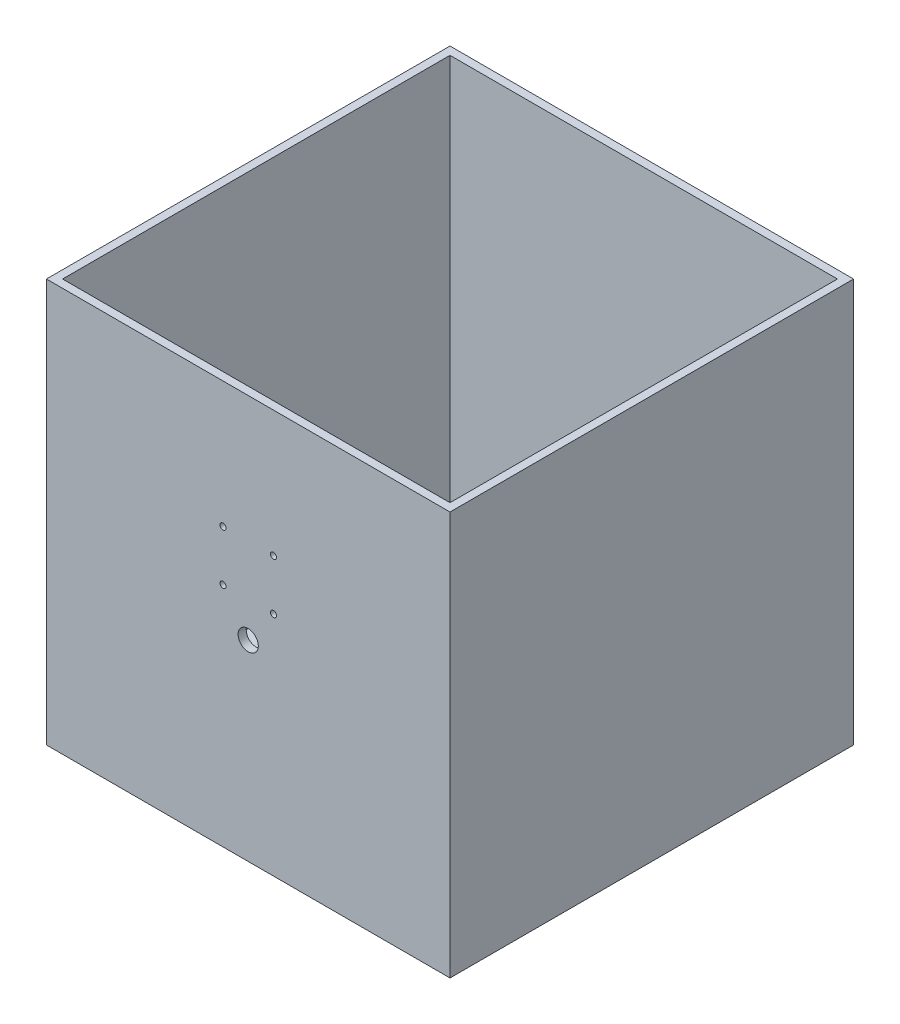
ISO-10303-21;
HEADER;
FILE_DESCRIPTION(('STEP AP214'),'2;1');
FILE_NAME('part.step','',(''),(''),'','','');
FILE_SCHEMA(('AUTOMOTIVE_DESIGN { 1 0 10303 214 1 1 1 1 }'));
ENDSEC;
DATA;
#1=APPLICATION_CONTEXT('core data for automotive mechanical design processes');
#2=APPLICATION_PROTOCOL_DEFINITION('international standard','automotive_design',2000,#1);
#3=PRODUCT_CONTEXT('',#1,'mechanical');
#4=PRODUCT('Part','Part','',(#3));
#5=PRODUCT_RELATED_PRODUCT_CATEGORY('part','',(#4));
#6=PRODUCT_DEFINITION_FORMATION('','',#4);
#7=PRODUCT_DEFINITION_CONTEXT('part definition',#1,'design');
#8=PRODUCT_DEFINITION('design','',#6,#7);
#9=PRODUCT_DEFINITION_SHAPE('','',#8);
#10=(LENGTH_UNIT() NAMED_UNIT(*) SI_UNIT(.MILLI.,.METRE.));
#11=(NAMED_UNIT(*) PLANE_ANGLE_UNIT() SI_UNIT($,.RADIAN.));
#12=(NAMED_UNIT(*) SI_UNIT($,.STERADIAN.) SOLID_ANGLE_UNIT());
#13=UNCERTAINTY_MEASURE_WITH_UNIT(LENGTH_MEASURE(1.E-05),#10,'distance_accuracy_value','');
#14=(GEOMETRIC_REPRESENTATION_CONTEXT(3) GLOBAL_UNCERTAINTY_ASSIGNED_CONTEXT((#13)) GLOBAL_UNIT_ASSIGNED_CONTEXT((#10,
#11,#12)) REPRESENTATION_CONTEXT('',''));
#15=CARTESIAN_POINT('',(0.,0.,0.));
#16=DIRECTION('',(0.,0.,1.));
#17=DIRECTION('',(1.,0.,0.));
#18=AXIS2_PLACEMENT_3D('',#15,#16,#17);
#19=CARTESIAN_POINT('',(0.,200.,0.));
#20=DIRECTION('',(0.,-1.,0.));
#21=DIRECTION('',(0.,0.,-1.));
#22=AXIS2_PLACEMENT_3D('',#19,#20,#21);
#23=PLANE('',#22);
#24=DIRECTION('',(0.,0.,-1.));
#25=VECTOR('',#24,1.);
#26=CARTESIAN_POINT('',(100.,200.,100.));
#27=LINE('',#26,#25);
#28=CARTESIAN_POINT('',(100.,200.,100.));
#29=VERTEX_POINT('',#28);
#30=CARTESIAN_POINT('',(100.,200.,-100.));
#31=VERTEX_POINT('',#30);
#32=EDGE_CURVE('E141',#29,#31,#27,.T.);
#33=ORIENTED_EDGE('',*,*,#32,.T.);
#34=DIRECTION('',(-1.,0.,0.));
#35=VECTOR('',#34,1.);
#36=CARTESIAN_POINT('',(-100.,200.,-100.));
#37=LINE('',#36,#35);
#38=CARTESIAN_POINT('',(-100.,200.,-100.));
#39=VERTEX_POINT('',#38);
#40=EDGE_CURVE('E85',#31,#39,#37,.T.);
#41=ORIENTED_EDGE('',*,*,#40,.T.);
#42=DIRECTION('',(0.,0.,1.));
#43=VECTOR('',#42,1.);
#44=CARTESIAN_POINT('',(-100.,200.,100.));
#45=LINE('',#44,#43);
#46=CARTESIAN_POINT('',(-100.,200.,100.));
#47=VERTEX_POINT('',#46);
#48=EDGE_CURVE('E144',#39,#47,#45,.T.);
#49=ORIENTED_EDGE('',*,*,#48,.T.);
#50=DIRECTION('',(1.,0.,0.));
#51=VECTOR('',#50,1.);
#52=CARTESIAN_POINT('',(-100.,200.,100.));
#53=LINE('',#52,#51);
#54=EDGE_CURVE('E57',#47,#29,#53,.T.);
#55=ORIENTED_EDGE('',*,*,#54,.T.);
#56=EDGE_LOOP('',(#33,#41,#49,#55));
#57=FACE_BOUND('',#56,.T.);
#58=DIRECTION('',(0.,0.,-1.));
#59=VECTOR('',#58,1.);
#60=CARTESIAN_POINT('',(96.,200.,0.));
#61=LINE('',#60,#59);
#62=CARTESIAN_POINT('',(96.,200.,96.));
#63=VERTEX_POINT('',#62);
#64=CARTESIAN_POINT('',(96.,200.,-96.));
#65=VERTEX_POINT('',#64);
#66=EDGE_CURVE('E130',#63,#65,#61,.T.);
#67=ORIENTED_EDGE('',*,*,#66,.F.);
#68=DIRECTION('',(1.,0.,0.));
#69=VECTOR('',#68,1.);
#70=CARTESIAN_POINT('',(0.,200.,96.));
#71=LINE('',#70,#69);
#72=CARTESIAN_POINT('',(-96.,200.,96.));
#73=VERTEX_POINT('',#72);
#74=EDGE_CURVE('E139',#73,#63,#71,.T.);
#75=ORIENTED_EDGE('',*,*,#74,.F.);
#76=DIRECTION('',(0.,0.,1.));
#77=VECTOR('',#76,1.);
#78=CARTESIAN_POINT('',(-96.,200.,0.));
#79=LINE('',#78,#77);
#80=CARTESIAN_POINT('',(-96.,200.,-96.));
#81=VERTEX_POINT('',#80);
#82=EDGE_CURVE('E137',#81,#73,#79,.T.);
#83=ORIENTED_EDGE('',*,*,#82,.F.);
#84=DIRECTION('',(-1.,0.,0.));
#85=VECTOR('',#84,1.);
#86=CARTESIAN_POINT('',(0.,200.,-96.));
#87=LINE('',#86,#85);
#88=EDGE_CURVE('E122',#65,#81,#87,.T.);
#89=ORIENTED_EDGE('',*,*,#88,.F.);
#90=EDGE_LOOP('',(#67,#75,#83,#89));
#91=FACE_BOUND('',#90,.T.);
#92=ADVANCED_FACE('F33',(#57,#91),#23,.F.);
#93=CARTESIAN_POINT('',(100.,200.,100.));
#94=DIRECTION('',(-1.,0.,0.));
#95=DIRECTION('',(0.,0.,1.));
#96=AXIS2_PLACEMENT_3D('',#93,#94,#95);
#97=PLANE('',#96);
#98=DIRECTION('',(0.,0.,-1.));
#99=VECTOR('',#98,1.);
#100=CARTESIAN_POINT('',(100.,0.,100.));
#101=LINE('',#100,#99);
#102=CARTESIAN_POINT('',(100.,0.,100.));
#103=VERTEX_POINT('',#102);
#104=CARTESIAN_POINT('',(100.,0.,-100.));
#105=VERTEX_POINT('',#104);
#106=EDGE_CURVE('E148',#103,#105,#101,.T.);
#107=ORIENTED_EDGE('',*,*,#106,.T.);
#108=DIRECTION('',(0.,-1.,0.));
#109=VECTOR('',#108,1.);
#110=CARTESIAN_POINT('',(100.,200.,-100.));
#111=LINE('',#110,#109);
#112=EDGE_CURVE('E11',#31,#105,#111,.T.);
#113=ORIENTED_EDGE('',*,*,#112,.F.);
#114=ORIENTED_EDGE('',*,*,#32,.F.);
#115=DIRECTION('',(0.,-1.,0.));
#116=VECTOR('',#115,1.);
#117=CARTESIAN_POINT('',(100.,200.,100.));
#118=LINE('',#117,#116);
#119=EDGE_CURVE('E147',#29,#103,#118,.T.);
#120=ORIENTED_EDGE('',*,*,#119,.T.);
#121=EDGE_LOOP('',(#107,#113,#114,#120));
#122=FACE_BOUND('',#121,.T.);
#123=ADVANCED_FACE('F35',(#122),#97,.F.);
#124=CARTESIAN_POINT('',(-100.,200.,-100.));
#125=DIRECTION('',(0.,0.,1.));
#126=DIRECTION('',(1.,0.,0.));
#127=AXIS2_PLACEMENT_3D('',#124,#125,#126);
#128=PLANE('',#127);
#129=DIRECTION('',(-1.,0.,0.));
#130=VECTOR('',#129,1.);
#131=CARTESIAN_POINT('',(-100.,0.,-100.));
#132=LINE('',#131,#130);
#133=CARTESIAN_POINT('',(-100.,0.,-100.));
#134=VERTEX_POINT('',#133);
#135=EDGE_CURVE('E151',#105,#134,#132,.T.);
#136=ORIENTED_EDGE('',*,*,#135,.T.);
#137=DIRECTION('',(0.,-1.,0.));
#138=VECTOR('',#137,1.);
#139=CARTESIAN_POINT('',(-100.,200.,-100.));
#140=LINE('',#139,#138);
#141=EDGE_CURVE('E41',#39,#134,#140,.T.);
#142=ORIENTED_EDGE('',*,*,#141,.F.);
#143=ORIENTED_EDGE('',*,*,#40,.F.);
#144=ORIENTED_EDGE('',*,*,#112,.T.);
#145=EDGE_LOOP('',(#136,#142,#143,#144));
#146=FACE_BOUND('',#145,.T.);
#147=ADVANCED_FACE('F182',(#146),#128,.F.);
#148=CARTESIAN_POINT('',(-100.,200.,100.));
#149=DIRECTION('',(1.,0.,0.));
#150=DIRECTION('',(0.,0.,-1.));
#151=AXIS2_PLACEMENT_3D('',#148,#149,#150);
#152=PLANE('',#151);
#153=CARTESIAN_POINT('',(-100.,15.,-70.));
#154=DIRECTION('',(-1.,0.,0.));
#155=DIRECTION('',(0.,0.,1.));
#156=AXIS2_PLACEMENT_3D('',#153,#154,#155);
#157=CIRCLE('',#156,3.00000000000001);
#158=CARTESIAN_POINT('',(-100.,15.,-67.));
#159=VERTEX_POINT('',#158);
#160=EDGE_CURVE('E238',#159,#159,#157,.T.);
#161=ORIENTED_EDGE('',*,*,#160,.F.);
#162=EDGE_LOOP('',(#161));
#163=FACE_BOUND('',#162,.T.);
#164=DIRECTION('',(0.,0.,1.));
#165=VECTOR('',#164,1.);
#166=CARTESIAN_POINT('',(-100.,0.,100.));
#167=LINE('',#166,#165);
#168=CARTESIAN_POINT('',(-100.,0.,100.));
#169=VERTEX_POINT('',#168);
#170=EDGE_CURVE('E153',#134,#169,#167,.T.);
#171=ORIENTED_EDGE('',*,*,#170,.T.);
#172=DIRECTION('',(0.,-1.,0.));
#173=VECTOR('',#172,1.);
#174=CARTESIAN_POINT('',(-100.,200.,100.));
#175=LINE('',#174,#173);
#176=EDGE_CURVE('E157',#47,#169,#175,.T.);
#177=ORIENTED_EDGE('',*,*,#176,.F.);
#178=ORIENTED_EDGE('',*,*,#48,.F.);
#179=ORIENTED_EDGE('',*,*,#141,.T.);
#180=EDGE_LOOP('',(#171,#177,#178,#179));
#181=FACE_BOUND('',#180,.T.);
#182=ADVANCED_FACE('F162',(#163,#181),#152,.F.);
#183=CARTESIAN_POINT('',(-100.,200.,100.));
#184=DIRECTION('',(0.,0.,-1.));
#185=DIRECTION('',(-1.,0.,0.));
#186=AXIS2_PLACEMENT_3D('',#183,#184,#185);
#187=PLANE('',#186);
#188=CARTESIAN_POINT('',(0.,95.,100.));
#189=DIRECTION('',(0.,0.,1.));
#190=DIRECTION('',(1.,0.,0.));
#191=AXIS2_PLACEMENT_3D('',#188,#189,#190);
#192=CIRCLE('',#191,5.);
#193=CARTESIAN_POINT('',(5.,95.,100.));
#194=VERTEX_POINT('',#193);
#195=EDGE_CURVE('E242',#194,#194,#192,.T.);
#196=ORIENTED_EDGE('',*,*,#195,.F.);
#197=EDGE_LOOP('',(#196));
#198=FACE_BOUND('',#197,.T.);
#199=CARTESIAN_POINT('',(-12.5,112.5,100.));
#200=DIRECTION('',(0.,0.,1.));
#201=DIRECTION('',(1.,0.,0.));
#202=AXIS2_PLACEMENT_3D('',#199,#200,#201);
#203=CIRCLE('',#202,1.5);
#204=CARTESIAN_POINT('',(-11.,112.5,100.));
#205=VERTEX_POINT('',#204);
#206=EDGE_CURVE('E249',#205,#205,#203,.T.);
#207=ORIENTED_EDGE('',*,*,#206,.F.);
#208=EDGE_LOOP('',(#207));
#209=FACE_BOUND('',#208,.T.);
#210=CARTESIAN_POINT('',(12.5,112.5,100.));
#211=DIRECTION('',(0.,0.,1.));
#212=DIRECTION('',(1.,0.,0.));
#213=AXIS2_PLACEMENT_3D('',#210,#211,#212);
#214=CIRCLE('',#213,1.5);
#215=CARTESIAN_POINT('',(14.,112.5,100.));
#216=VERTEX_POINT('',#215);
#217=EDGE_CURVE('E255',#216,#216,#214,.T.);
#218=ORIENTED_EDGE('',*,*,#217,.F.);
#219=EDGE_LOOP('',(#218));
#220=FACE_BOUND('',#219,.T.);
#221=CARTESIAN_POINT('',(12.5,137.5,100.));
#222=DIRECTION('',(0.,0.,1.));
#223=DIRECTION('',(1.,0.,0.));
#224=AXIS2_PLACEMENT_3D('',#221,#222,#223);
#225=CIRCLE('',#224,1.5);
#226=CARTESIAN_POINT('',(14.,137.5,100.));
#227=VERTEX_POINT('',#226);
#228=EDGE_CURVE('E261',#227,#227,#225,.T.);
#229=ORIENTED_EDGE('',*,*,#228,.F.);
#230=EDGE_LOOP('',(#229));
#231=FACE_BOUND('',#230,.T.);
#232=CARTESIAN_POINT('',(-12.5,137.5,100.));
#233=DIRECTION('',(0.,0.,1.));
#234=DIRECTION('',(1.,0.,0.));
#235=AXIS2_PLACEMENT_3D('',#232,#233,#234);
#236=CIRCLE('',#235,1.5);
#237=CARTESIAN_POINT('',(-11.,137.5,100.));
#238=VERTEX_POINT('',#237);
#239=EDGE_CURVE('E267',#238,#238,#236,.T.);
#240=ORIENTED_EDGE('',*,*,#239,.F.);
#241=EDGE_LOOP('',(#240));
#242=FACE_BOUND('',#241,.T.);
#243=DIRECTION('',(1.,0.,0.));
#244=VECTOR('',#243,1.);
#245=CARTESIAN_POINT('',(-100.,0.,100.));
#246=LINE('',#245,#244);
#247=EDGE_CURVE('E78',#169,#103,#246,.T.);
#248=ORIENTED_EDGE('',*,*,#247,.T.);
#249=ORIENTED_EDGE('',*,*,#119,.F.);
#250=ORIENTED_EDGE('',*,*,#54,.F.);
#251=ORIENTED_EDGE('',*,*,#176,.T.);
#252=EDGE_LOOP('',(#248,#249,#250,#251));
#253=FACE_BOUND('',#252,.T.);
#254=ADVANCED_FACE('F170',(#198,#209,#220,#231,#242,#253),#187,.F.);
#255=CARTESIAN_POINT('',(0.,0.,0.));
#256=DIRECTION('',(0.,-1.,0.));
#257=DIRECTION('',(0.,0.,-1.));
#258=AXIS2_PLACEMENT_3D('',#255,#256,#257);
#259=PLANE('',#258);
#260=ORIENTED_EDGE('',*,*,#106,.F.);
#261=ORIENTED_EDGE('',*,*,#247,.F.);
#262=ORIENTED_EDGE('',*,*,#170,.F.);
#263=ORIENTED_EDGE('',*,*,#135,.F.);
#264=EDGE_LOOP('',(#260,#261,#262,#263));
#265=FACE_BOUND('',#264,.T.);
#266=ADVANCED_FACE('F166',(#265),#259,.T.);
#267=CARTESIAN_POINT('',(96.,200.,100.));
#268=DIRECTION('',(-1.,0.,0.));
#269=DIRECTION('',(0.,0.,1.));
#270=AXIS2_PLACEMENT_3D('',#267,#268,#269);
#271=PLANE('',#270);
#272=DIRECTION('',(0.,0.,-1.));
#273=VECTOR('',#272,1.);
#274=CARTESIAN_POINT('',(96.,4.,0.));
#275=LINE('',#274,#273);
#276=CARTESIAN_POINT('',(96.,4.,96.));
#277=VERTEX_POINT('',#276);
#278=CARTESIAN_POINT('',(96.,4.,-96.));
#279=VERTEX_POINT('',#278);
#280=EDGE_CURVE('E113',#277,#279,#275,.T.);
#281=ORIENTED_EDGE('',*,*,#280,.F.);
#282=DIRECTION('',(0.,-1.,0.));
#283=VECTOR('',#282,1.);
#284=CARTESIAN_POINT('',(96.,200.,96.));
#285=LINE('',#284,#283);
#286=EDGE_CURVE('E133',#63,#277,#285,.T.);
#287=ORIENTED_EDGE('',*,*,#286,.F.);
#288=ORIENTED_EDGE('',*,*,#66,.T.);
#289=DIRECTION('',(0.,-1.,0.));
#290=VECTOR('',#289,1.);
#291=CARTESIAN_POINT('',(96.,200.,-96.));
#292=LINE('',#291,#290);
#293=EDGE_CURVE('E125',#65,#279,#292,.T.);
#294=ORIENTED_EDGE('',*,*,#293,.T.);
#295=EDGE_LOOP('',(#281,#287,#288,#294));
#296=FACE_BOUND('',#295,.T.);
#297=ADVANCED_FACE('F179',(#296),#271,.T.);
#298=CARTESIAN_POINT('',(-100.,200.,-96.));
#299=DIRECTION('',(0.,0.,1.));
#300=DIRECTION('',(1.,0.,0.));
#301=AXIS2_PLACEMENT_3D('',#298,#299,#300);
#302=PLANE('',#301);
#303=DIRECTION('',(-1.,0.,0.));
#304=VECTOR('',#303,1.);
#305=CARTESIAN_POINT('',(0.,4.,-96.));
#306=LINE('',#305,#304);
#307=CARTESIAN_POINT('',(-96.,4.,-96.));
#308=VERTEX_POINT('',#307);
#309=EDGE_CURVE('E107',#279,#308,#306,.T.);
#310=ORIENTED_EDGE('',*,*,#309,.F.);
#311=ORIENTED_EDGE('',*,*,#293,.F.);
#312=ORIENTED_EDGE('',*,*,#88,.T.);
#313=DIRECTION('',(0.,-1.,0.));
#314=VECTOR('',#313,1.);
#315=CARTESIAN_POINT('',(-96.,200.,-96.));
#316=LINE('',#315,#314);
#317=EDGE_CURVE('E119',#81,#308,#316,.T.);
#318=ORIENTED_EDGE('',*,*,#317,.T.);
#319=EDGE_LOOP('',(#310,#311,#312,#318));
#320=FACE_BOUND('',#319,.T.);
#321=ADVANCED_FACE('F120',(#320),#302,.T.);
#322=CARTESIAN_POINT('',(-96.,200.,100.));
#323=DIRECTION('',(1.,0.,0.));
#324=DIRECTION('',(0.,0.,-1.));
#325=AXIS2_PLACEMENT_3D('',#322,#323,#324);
#326=PLANE('',#325);
#327=CARTESIAN_POINT('',(-96.,15.,-70.));
#328=DIRECTION('',(1.,0.,0.));
#329=DIRECTION('',(0.,0.,-1.));
#330=AXIS2_PLACEMENT_3D('',#327,#328,#329);
#331=CIRCLE('',#330,3.00000000000001);
#332=CARTESIAN_POINT('',(-96.,15.,-67.));
#333=VERTEX_POINT('',#332);
#334=EDGE_CURVE('E235',#333,#333,#331,.F.);
#335=ORIENTED_EDGE('',*,*,#334,.T.);
#336=EDGE_LOOP('',(#335));
#337=FACE_BOUND('',#336,.T.);
#338=DIRECTION('',(0.,0.,1.));
#339=VECTOR('',#338,1.);
#340=CARTESIAN_POINT('',(-96.,4.,0.));
#341=LINE('',#340,#339);
#342=CARTESIAN_POINT('',(-96.,4.,96.));
#343=VERTEX_POINT('',#342);
#344=EDGE_CURVE('E111',#308,#343,#341,.T.);
#345=ORIENTED_EDGE('',*,*,#344,.F.);
#346=ORIENTED_EDGE('',*,*,#317,.F.);
#347=ORIENTED_EDGE('',*,*,#82,.T.);
#348=DIRECTION('',(0.,-1.,0.));
#349=VECTOR('',#348,1.);
#350=CARTESIAN_POINT('',(-96.,200.,96.));
#351=LINE('',#350,#349);
#352=EDGE_CURVE('E48',#73,#343,#351,.T.);
#353=ORIENTED_EDGE('',*,*,#352,.T.);
#354=EDGE_LOOP('',(#345,#346,#347,#353));
#355=FACE_BOUND('',#354,.T.);
#356=ADVANCED_FACE('F127',(#337,#355),#326,.T.);
#357=CARTESIAN_POINT('',(-100.,200.,96.));
#358=DIRECTION('',(0.,0.,-1.));
#359=DIRECTION('',(-1.,0.,0.));
#360=AXIS2_PLACEMENT_3D('',#357,#358,#359);
#361=PLANE('',#360);
#362=CARTESIAN_POINT('',(0.,95.,96.));
#363=DIRECTION('',(0.,0.,-1.));
#364=DIRECTION('',(-1.,0.,0.));
#365=AXIS2_PLACEMENT_3D('',#362,#363,#364);
#366=CIRCLE('',#365,5.);
#367=CARTESIAN_POINT('',(5.,95.,96.));
#368=VERTEX_POINT('',#367);
#369=EDGE_CURVE('E239',#368,#368,#366,.F.);
#370=ORIENTED_EDGE('',*,*,#369,.T.);
#371=EDGE_LOOP('',(#370));
#372=FACE_BOUND('',#371,.T.);
#373=CARTESIAN_POINT('',(-12.5,112.5,96.));
#374=DIRECTION('',(0.,0.,-1.));
#375=DIRECTION('',(-1.,0.,0.));
#376=AXIS2_PLACEMENT_3D('',#373,#374,#375);
#377=CIRCLE('',#376,1.5);
#378=CARTESIAN_POINT('',(-11.,112.5,96.));
#379=VERTEX_POINT('',#378);
#380=EDGE_CURVE('E247',#379,#379,#377,.F.);
#381=ORIENTED_EDGE('',*,*,#380,.T.);
#382=EDGE_LOOP('',(#381));
#383=FACE_BOUND('',#382,.T.);
#384=CARTESIAN_POINT('',(12.5,112.5,96.));
#385=DIRECTION('',(0.,0.,-1.));
#386=DIRECTION('',(-1.,0.,0.));
#387=AXIS2_PLACEMENT_3D('',#384,#385,#386);
#388=CIRCLE('',#387,1.5);
#389=CARTESIAN_POINT('',(14.,112.5,96.));
#390=VERTEX_POINT('',#389);
#391=EDGE_CURVE('E252',#390,#390,#388,.F.);
#392=ORIENTED_EDGE('',*,*,#391,.T.);
#393=EDGE_LOOP('',(#392));
#394=FACE_BOUND('',#393,.T.);
#395=CARTESIAN_POINT('',(12.5,137.5,96.));
#396=DIRECTION('',(0.,0.,-1.));
#397=DIRECTION('',(-1.,0.,0.));
#398=AXIS2_PLACEMENT_3D('',#395,#396,#397);
#399=CIRCLE('',#398,1.5);
#400=CARTESIAN_POINT('',(14.,137.5,96.));
#401=VERTEX_POINT('',#400);
#402=EDGE_CURVE('E258',#401,#401,#399,.F.);
#403=ORIENTED_EDGE('',*,*,#402,.T.);
#404=EDGE_LOOP('',(#403));
#405=FACE_BOUND('',#404,.T.);
#406=CARTESIAN_POINT('',(-12.5,137.5,96.));
#407=DIRECTION('',(0.,0.,-1.));
#408=DIRECTION('',(-1.,0.,0.));
#409=AXIS2_PLACEMENT_3D('',#406,#407,#408);
#410=CIRCLE('',#409,1.5);
#411=CARTESIAN_POINT('',(-11.,137.5,96.));
#412=VERTEX_POINT('',#411);
#413=EDGE_CURVE('E264',#412,#412,#410,.F.);
#414=ORIENTED_EDGE('',*,*,#413,.T.);
#415=EDGE_LOOP('',(#414));
#416=FACE_BOUND('',#415,.T.);
#417=DIRECTION('',(1.,0.,0.));
#418=VECTOR('',#417,1.);
#419=CARTESIAN_POINT('',(0.,4.,96.));
#420=LINE('',#419,#418);
#421=EDGE_CURVE('E128',#343,#277,#420,.T.);
#422=ORIENTED_EDGE('',*,*,#421,.F.);
#423=ORIENTED_EDGE('',*,*,#352,.F.);
#424=ORIENTED_EDGE('',*,*,#74,.T.);
#425=ORIENTED_EDGE('',*,*,#286,.T.);
#426=EDGE_LOOP('',(#422,#423,#424,#425));
#427=FACE_BOUND('',#426,.T.);
#428=ADVANCED_FACE('F197',(#372,#383,#394,#405,#416,#427),#361,.T.);
#429=CARTESIAN_POINT('',(0.,4.,0.));
#430=DIRECTION('',(0.,-1.,0.));
#431=DIRECTION('',(0.,0.,-1.));
#432=AXIS2_PLACEMENT_3D('',#429,#430,#431);
#433=PLANE('',#432);
#434=ORIENTED_EDGE('',*,*,#280,.T.);
#435=ORIENTED_EDGE('',*,*,#309,.T.);
#436=ORIENTED_EDGE('',*,*,#344,.T.);
#437=ORIENTED_EDGE('',*,*,#421,.T.);
#438=EDGE_LOOP('',(#434,#435,#436,#437));
#439=FACE_BOUND('',#438,.T.);
#440=ADVANCED_FACE('F109',(#439),#433,.F.);
#441=CARTESIAN_POINT('',(-12.5,137.5,-100.001));
#442=DIRECTION('',(0.,0.,1.));
#443=DIRECTION('',(1.,0.,0.));
#444=AXIS2_PLACEMENT_3D('',#441,#442,#443);
#445=CYLINDRICAL_SURFACE('',#444,1.5);
#446=CARTESIAN_POINT('',(-11.,137.5,96.));
#447=CARTESIAN_POINT('',(-11.,137.5,96.0416666666667));
#448=CARTESIAN_POINT('',(-11.,137.5,96.0833333333333));
#449=CARTESIAN_POINT('',(-11.,137.5,96.1666666666667));
#450=CARTESIAN_POINT('',(-11.,137.5,96.2083333333333));
#451=CARTESIAN_POINT('',(-11.,137.5,96.2916666666667));
#452=CARTESIAN_POINT('',(-11.,137.5,96.3333333333333));
#453=CARTESIAN_POINT('',(-11.,137.5,96.4166666666667));
#454=CARTESIAN_POINT('',(-11.,137.5,96.4583333333333));
#455=CARTESIAN_POINT('',(-11.,137.5,96.5416666666667));
#456=CARTESIAN_POINT('',(-11.,137.5,96.5833333333333));
#457=CARTESIAN_POINT('',(-11.,137.5,96.6666666666667));
#458=CARTESIAN_POINT('',(-11.,137.5,96.7083333333333));
#459=CARTESIAN_POINT('',(-11.,137.5,96.7916666666667));
#460=CARTESIAN_POINT('',(-11.,137.5,96.8333333333333));
#461=CARTESIAN_POINT('',(-11.,137.5,96.9166666666667));
#462=CARTESIAN_POINT('',(-11.,137.5,96.9583333333333));
#463=CARTESIAN_POINT('',(-11.,137.5,97.0416666666667));
#464=CARTESIAN_POINT('',(-11.,137.5,97.0833333333333));
#465=CARTESIAN_POINT('',(-11.,137.5,97.1666666666667));
#466=CARTESIAN_POINT('',(-11.,137.5,97.2083333333333));
#467=CARTESIAN_POINT('',(-11.,137.5,97.2916666666667));
#468=CARTESIAN_POINT('',(-11.,137.5,97.3333333333333));
#469=CARTESIAN_POINT('',(-11.,137.5,97.4166666666667));
#470=CARTESIAN_POINT('',(-11.,137.5,97.4583333333333));
#471=CARTESIAN_POINT('',(-11.,137.5,97.5416666666667));
#472=CARTESIAN_POINT('',(-11.,137.5,97.5833333333333));
#473=CARTESIAN_POINT('',(-11.,137.5,97.6666666666667));
#474=CARTESIAN_POINT('',(-11.,137.5,97.7083333333333));
#475=CARTESIAN_POINT('',(-11.,137.5,97.7916666666667));
#476=CARTESIAN_POINT('',(-11.,137.5,97.8333333333333));
#477=CARTESIAN_POINT('',(-11.,137.5,97.9166666666667));
#478=CARTESIAN_POINT('',(-11.,137.5,97.9583333333333));
#479=CARTESIAN_POINT('',(-11.,137.5,98.0416666666667));
#480=CARTESIAN_POINT('',(-11.,137.5,98.0833333333333));
#481=CARTESIAN_POINT('',(-11.,137.5,98.1666666666667));
#482=CARTESIAN_POINT('',(-11.,137.5,98.2083333333333));
#483=CARTESIAN_POINT('',(-11.,137.5,98.2916666666667));
#484=CARTESIAN_POINT('',(-11.,137.5,98.3333333333333));
#485=CARTESIAN_POINT('',(-11.,137.5,98.4166666666667));
#486=CARTESIAN_POINT('',(-11.,137.5,98.4583333333333));
#487=CARTESIAN_POINT('',(-11.,137.5,98.5416666666667));
#488=CARTESIAN_POINT('',(-11.,137.5,98.5833333333333));
#489=CARTESIAN_POINT('',(-11.,137.5,98.6666666666667));
#490=CARTESIAN_POINT('',(-11.,137.5,98.7083333333333));
#491=CARTESIAN_POINT('',(-11.,137.5,98.7916666666667));
#492=CARTESIAN_POINT('',(-11.,137.5,98.8333333333333));
#493=CARTESIAN_POINT('',(-11.,137.5,98.9166666666667));
#494=CARTESIAN_POINT('',(-11.,137.5,98.9583333333333));
#495=CARTESIAN_POINT('',(-11.,137.5,99.0416666666667));
#496=CARTESIAN_POINT('',(-11.,137.5,99.0833333333333));
#497=CARTESIAN_POINT('',(-11.,137.5,99.1666666666667));
#498=CARTESIAN_POINT('',(-11.,137.5,99.2083333333333));
#499=CARTESIAN_POINT('',(-11.,137.5,99.2916666666667));
#500=CARTESIAN_POINT('',(-11.,137.5,99.3333333333333));
#501=CARTESIAN_POINT('',(-11.,137.5,99.4166666666667));
#502=CARTESIAN_POINT('',(-11.,137.5,99.4583333333333));
#503=CARTESIAN_POINT('',(-11.,137.5,99.5416666666667));
#504=CARTESIAN_POINT('',(-11.,137.5,99.5833333333333));
#505=CARTESIAN_POINT('',(-11.,137.5,99.6666666666667));
#506=CARTESIAN_POINT('',(-11.,137.5,99.7083333333333));
#507=CARTESIAN_POINT('',(-11.,137.5,99.7916666666667));
#508=CARTESIAN_POINT('',(-11.,137.5,99.8333333333333));
#509=CARTESIAN_POINT('',(-11.,137.5,99.9166666666667));
#510=CARTESIAN_POINT('',(-11.,137.5,99.9583333333333));
#511=CARTESIAN_POINT('',(-11.,137.5,100.));
#512=B_SPLINE_CURVE_WITH_KNOTS('',3,(#446,#447,#448,#449,#450,#451,#452,#453,#454,#455,#456,
#457,#458,#459,#460,#461,#462,#463,#464,#465,#466,#467,#468,#469,#470,#471,#472,#473,#474,#475,
#476,#477,#478,#479,#480,#481,#482,#483,#484,#485,#486,#487,#488,#489,#490,#491,#492,#493,#494,
#495,#496,#497,#498,#499,#500,#501,#502,#503,#504,#505,#506,#507,#508,#509,#510,#511),
.UNSPECIFIED.,.F.,.F.,(4,2,2,2,2,2,2,2,2,2,2,2,2,2,2,2,2,2,2,2,2,2,2,2,2,2,2,2,2,2,2,2,4),(0.,
0.124999999999986,0.25,0.375000000000014,0.5,0.624999999999987,0.750000000000001,
0.875000000000015,1.,1.12499999999999,1.25,1.37500000000002,1.5,1.62499999999999,1.75,
1.87500000000002,2.,2.12499999999999,2.25,2.37500000000002,2.5,2.62499999999999,2.75,
2.87500000000002,3.,3.12499999999999,3.25,3.37500000000002,3.5,3.62499999999999,3.75,
3.87500000000002,4.),.UNSPECIFIED.);
#513=EDGE_CURVE('BSEAM196',#412,#238,#512,.T.);
#514=ORIENTED_EDGE('',*,*,#413,.F.);
#515=ORIENTED_EDGE('',*,*,#239,.T.);
#516=ORIENTED_EDGE('',*,*,#513,.T.);
#517=ORIENTED_EDGE('',*,*,#513,.F.);
#518=EDGE_LOOP('',(#514,#516,#515,#517));
#519=FACE_BOUND('',#518,.T.);
#520=ADVANCED_FACE('F196',(#519),#445,.F.);
#521=CARTESIAN_POINT('',(12.5,137.5,-100.001));
#522=DIRECTION('',(0.,0.,1.));
#523=DIRECTION('',(1.,0.,0.));
#524=AXIS2_PLACEMENT_3D('',#521,#522,#523);
#525=CYLINDRICAL_SURFACE('',#524,1.5);
#526=CARTESIAN_POINT('',(14.,137.5,96.));
#527=CARTESIAN_POINT('',(14.,137.5,96.0416666666667));
#528=CARTESIAN_POINT('',(14.,137.5,96.0833333333333));
#529=CARTESIAN_POINT('',(14.,137.5,96.1666666666667));
#530=CARTESIAN_POINT('',(14.,137.5,96.2083333333333));
#531=CARTESIAN_POINT('',(14.,137.5,96.2916666666667));
#532=CARTESIAN_POINT('',(14.,137.5,96.3333333333333));
#533=CARTESIAN_POINT('',(14.,137.5,96.4166666666667));
#534=CARTESIAN_POINT('',(14.,137.5,96.4583333333333));
#535=CARTESIAN_POINT('',(14.,137.5,96.5416666666667));
#536=CARTESIAN_POINT('',(14.,137.5,96.5833333333333));
#537=CARTESIAN_POINT('',(14.,137.5,96.6666666666667));
#538=CARTESIAN_POINT('',(14.,137.5,96.7083333333333));
#539=CARTESIAN_POINT('',(14.,137.5,96.7916666666667));
#540=CARTESIAN_POINT('',(14.,137.5,96.8333333333333));
#541=CARTESIAN_POINT('',(14.,137.5,96.9166666666667));
#542=CARTESIAN_POINT('',(14.,137.5,96.9583333333333));
#543=CARTESIAN_POINT('',(14.,137.5,97.0416666666667));
#544=CARTESIAN_POINT('',(14.,137.5,97.0833333333333));
#545=CARTESIAN_POINT('',(14.,137.5,97.1666666666667));
#546=CARTESIAN_POINT('',(14.,137.5,97.2083333333333));
#547=CARTESIAN_POINT('',(14.,137.5,97.2916666666667));
#548=CARTESIAN_POINT('',(14.,137.5,97.3333333333333));
#549=CARTESIAN_POINT('',(14.,137.5,97.4166666666667));
#550=CARTESIAN_POINT('',(14.,137.5,97.4583333333333));
#551=CARTESIAN_POINT('',(14.,137.5,97.5416666666667));
#552=CARTESIAN_POINT('',(14.,137.5,97.5833333333333));
#553=CARTESIAN_POINT('',(14.,137.5,97.6666666666667));
#554=CARTESIAN_POINT('',(14.,137.5,97.7083333333333));
#555=CARTESIAN_POINT('',(14.,137.5,97.7916666666667));
#556=CARTESIAN_POINT('',(14.,137.5,97.8333333333333));
#557=CARTESIAN_POINT('',(14.,137.5,97.9166666666667));
#558=CARTESIAN_POINT('',(14.,137.5,97.9583333333333));
#559=CARTESIAN_POINT('',(14.,137.5,98.0416666666667));
#560=CARTESIAN_POINT('',(14.,137.5,98.0833333333333));
#561=CARTESIAN_POINT('',(14.,137.5,98.1666666666667));
#562=CARTESIAN_POINT('',(14.,137.5,98.2083333333333));
#563=CARTESIAN_POINT('',(14.,137.5,98.2916666666667));
#564=CARTESIAN_POINT('',(14.,137.5,98.3333333333333));
#565=CARTESIAN_POINT('',(14.,137.5,98.4166666666667));
#566=CARTESIAN_POINT('',(14.,137.5,98.4583333333333));
#567=CARTESIAN_POINT('',(14.,137.5,98.5416666666667));
#568=CARTESIAN_POINT('',(14.,137.5,98.5833333333333));
#569=CARTESIAN_POINT('',(14.,137.5,98.6666666666667));
#570=CARTESIAN_POINT('',(14.,137.5,98.7083333333333));
#571=CARTESIAN_POINT('',(14.,137.5,98.7916666666667));
#572=CARTESIAN_POINT('',(14.,137.5,98.8333333333333));
#573=CARTESIAN_POINT('',(14.,137.5,98.9166666666667));
#574=CARTESIAN_POINT('',(14.,137.5,98.9583333333333));
#575=CARTESIAN_POINT('',(14.,137.5,99.0416666666667));
#576=CARTESIAN_POINT('',(14.,137.5,99.0833333333333));
#577=CARTESIAN_POINT('',(14.,137.5,99.1666666666667));
#578=CARTESIAN_POINT('',(14.,137.5,99.2083333333333));
#579=CARTESIAN_POINT('',(14.,137.5,99.2916666666667));
#580=CARTESIAN_POINT('',(14.,137.5,99.3333333333333));
#581=CARTESIAN_POINT('',(14.,137.5,99.4166666666667));
#582=CARTESIAN_POINT('',(14.,137.5,99.4583333333333));
#583=CARTESIAN_POINT('',(14.,137.5,99.5416666666667));
#584=CARTESIAN_POINT('',(14.,137.5,99.5833333333333));
#585=CARTESIAN_POINT('',(14.,137.5,99.6666666666667));
#586=CARTESIAN_POINT('',(14.,137.5,99.7083333333333));
#587=CARTESIAN_POINT('',(14.,137.5,99.7916666666667));
#588=CARTESIAN_POINT('',(14.,137.5,99.8333333333333));
#589=CARTESIAN_POINT('',(14.,137.5,99.9166666666667));
#590=CARTESIAN_POINT('',(14.,137.5,99.9583333333333));
#591=CARTESIAN_POINT('',(14.,137.5,100.));
#592=B_SPLINE_CURVE_WITH_KNOTS('',3,(#526,#527,#528,#529,#530,#531,#532,#533,#534,#535,#536,
#537,#538,#539,#540,#541,#542,#543,#544,#545,#546,#547,#548,#549,#550,#551,#552,#553,#554,#555,
#556,#557,#558,#559,#560,#561,#562,#563,#564,#565,#566,#567,#568,#569,#570,#571,#572,#573,#574,
#575,#576,#577,#578,#579,#580,#581,#582,#583,#584,#585,#586,#587,#588,#589,#590,#591),
.UNSPECIFIED.,.F.,.F.,(4,2,2,2,2,2,2,2,2,2,2,2,2,2,2,2,2,2,2,2,2,2,2,2,2,2,2,2,2,2,2,2,4),(0.,
0.124999999999986,0.25,0.375000000000014,0.5,0.624999999999987,0.750000000000001,
0.875000000000015,1.,1.12499999999999,1.25,1.37500000000002,1.5,1.62499999999999,1.75,
1.87500000000002,2.,2.12499999999999,2.25,2.37500000000002,2.5,2.62499999999999,2.75,
2.87500000000002,3.,3.12499999999999,3.25,3.37500000000002,3.5,3.62499999999999,3.75,
3.87500000000002,4.),.UNSPECIFIED.);
#593=EDGE_CURVE('BSEAM210',#401,#227,#592,.T.);
#594=ORIENTED_EDGE('',*,*,#402,.F.);
#595=ORIENTED_EDGE('',*,*,#228,.T.);
#596=ORIENTED_EDGE('',*,*,#593,.T.);
#597=ORIENTED_EDGE('',*,*,#593,.F.);
#598=EDGE_LOOP('',(#594,#596,#595,#597));
#599=FACE_BOUND('',#598,.T.);
#600=ADVANCED_FACE('F210',(#599),#525,.F.);
#601=CARTESIAN_POINT('',(12.5,112.5,-100.001));
#602=DIRECTION('',(0.,0.,1.));
#603=DIRECTION('',(1.,0.,0.));
#604=AXIS2_PLACEMENT_3D('',#601,#602,#603);
#605=CYLINDRICAL_SURFACE('',#604,1.5);
#606=CARTESIAN_POINT('',(14.,112.5,96.));
#607=CARTESIAN_POINT('',(14.,112.5,96.0416666666667));
#608=CARTESIAN_POINT('',(14.,112.5,96.0833333333333));
#609=CARTESIAN_POINT('',(14.,112.5,96.1666666666667));
#610=CARTESIAN_POINT('',(14.,112.5,96.2083333333333));
#611=CARTESIAN_POINT('',(14.,112.5,96.2916666666667));
#612=CARTESIAN_POINT('',(14.,112.5,96.3333333333333));
#613=CARTESIAN_POINT('',(14.,112.5,96.4166666666667));
#614=CARTESIAN_POINT('',(14.,112.5,96.4583333333333));
#615=CARTESIAN_POINT('',(14.,112.5,96.5416666666667));
#616=CARTESIAN_POINT('',(14.,112.5,96.5833333333333));
#617=CARTESIAN_POINT('',(14.,112.5,96.6666666666667));
#618=CARTESIAN_POINT('',(14.,112.5,96.7083333333333));
#619=CARTESIAN_POINT('',(14.,112.5,96.7916666666667));
#620=CARTESIAN_POINT('',(14.,112.5,96.8333333333333));
#621=CARTESIAN_POINT('',(14.,112.5,96.9166666666667));
#622=CARTESIAN_POINT('',(14.,112.5,96.9583333333333));
#623=CARTESIAN_POINT('',(14.,112.5,97.0416666666667));
#624=CARTESIAN_POINT('',(14.,112.5,97.0833333333333));
#625=CARTESIAN_POINT('',(14.,112.5,97.1666666666667));
#626=CARTESIAN_POINT('',(14.,112.5,97.2083333333333));
#627=CARTESIAN_POINT('',(14.,112.5,97.2916666666667));
#628=CARTESIAN_POINT('',(14.,112.5,97.3333333333333));
#629=CARTESIAN_POINT('',(14.,112.5,97.4166666666667));
#630=CARTESIAN_POINT('',(14.,112.5,97.4583333333333));
#631=CARTESIAN_POINT('',(14.,112.5,97.5416666666667));
#632=CARTESIAN_POINT('',(14.,112.5,97.5833333333333));
#633=CARTESIAN_POINT('',(14.,112.5,97.6666666666667));
#634=CARTESIAN_POINT('',(14.,112.5,97.7083333333333));
#635=CARTESIAN_POINT('',(14.,112.5,97.7916666666667));
#636=CARTESIAN_POINT('',(14.,112.5,97.8333333333333));
#637=CARTESIAN_POINT('',(14.,112.5,97.9166666666667));
#638=CARTESIAN_POINT('',(14.,112.5,97.9583333333333));
#639=CARTESIAN_POINT('',(14.,112.5,98.0416666666667));
#640=CARTESIAN_POINT('',(14.,112.5,98.0833333333333));
#641=CARTESIAN_POINT('',(14.,112.5,98.1666666666667));
#642=CARTESIAN_POINT('',(14.,112.5,98.2083333333333));
#643=CARTESIAN_POINT('',(14.,112.5,98.2916666666667));
#644=CARTESIAN_POINT('',(14.,112.5,98.3333333333333));
#645=CARTESIAN_POINT('',(14.,112.5,98.4166666666667));
#646=CARTESIAN_POINT('',(14.,112.5,98.4583333333333));
#647=CARTESIAN_POINT('',(14.,112.5,98.5416666666667));
#648=CARTESIAN_POINT('',(14.,112.5,98.5833333333333));
#649=CARTESIAN_POINT('',(14.,112.5,98.6666666666667));
#650=CARTESIAN_POINT('',(14.,112.5,98.7083333333333));
#651=CARTESIAN_POINT('',(14.,112.5,98.7916666666667));
#652=CARTESIAN_POINT('',(14.,112.5,98.8333333333333));
#653=CARTESIAN_POINT('',(14.,112.5,98.9166666666667));
#654=CARTESIAN_POINT('',(14.,112.5,98.9583333333333));
#655=CARTESIAN_POINT('',(14.,112.5,99.0416666666667));
#656=CARTESIAN_POINT('',(14.,112.5,99.0833333333333));
#657=CARTESIAN_POINT('',(14.,112.5,99.1666666666667));
#658=CARTESIAN_POINT('',(14.,112.5,99.2083333333333));
#659=CARTESIAN_POINT('',(14.,112.5,99.2916666666667));
#660=CARTESIAN_POINT('',(14.,112.5,99.3333333333333));
#661=CARTESIAN_POINT('',(14.,112.5,99.4166666666667));
#662=CARTESIAN_POINT('',(14.,112.5,99.4583333333333));
#663=CARTESIAN_POINT('',(14.,112.5,99.5416666666667));
#664=CARTESIAN_POINT('',(14.,112.5,99.5833333333333));
#665=CARTESIAN_POINT('',(14.,112.5,99.6666666666667));
#666=CARTESIAN_POINT('',(14.,112.5,99.7083333333333));
#667=CARTESIAN_POINT('',(14.,112.5,99.7916666666667));
#668=CARTESIAN_POINT('',(14.,112.5,99.8333333333333));
#669=CARTESIAN_POINT('',(14.,112.5,99.9166666666667));
#670=CARTESIAN_POINT('',(14.,112.5,99.9583333333333));
#671=CARTESIAN_POINT('',(14.,112.5,100.));
#672=B_SPLINE_CURVE_WITH_KNOTS('',3,(#606,#607,#608,#609,#610,#611,#612,#613,#614,#615,#616,
#617,#618,#619,#620,#621,#622,#623,#624,#625,#626,#627,#628,#629,#630,#631,#632,#633,#634,#635,
#636,#637,#638,#639,#640,#641,#642,#643,#644,#645,#646,#647,#648,#649,#650,#651,#652,#653,#654,
#655,#656,#657,#658,#659,#660,#661,#662,#663,#664,#665,#666,#667,#668,#669,#670,#671),
.UNSPECIFIED.,.F.,.F.,(4,2,2,2,2,2,2,2,2,2,2,2,2,2,2,2,2,2,2,2,2,2,2,2,2,2,2,2,2,2,2,2,4),(0.,
0.124999999999986,0.25,0.375000000000014,0.5,0.624999999999987,0.750000000000001,
0.875000000000015,1.,1.12499999999999,1.25,1.37500000000002,1.5,1.62499999999999,1.75,
1.87500000000002,2.,2.12499999999999,2.25,2.37500000000002,2.5,2.62499999999999,2.75,
2.87500000000002,3.,3.12499999999999,3.25,3.37500000000002,3.5,3.62499999999999,3.75,
3.87500000000002,4.),.UNSPECIFIED.);
#673=EDGE_CURVE('BSEAM214',#390,#216,#672,.T.);
#674=ORIENTED_EDGE('',*,*,#391,.F.);
#675=ORIENTED_EDGE('',*,*,#217,.T.);
#676=ORIENTED_EDGE('',*,*,#673,.T.);
#677=ORIENTED_EDGE('',*,*,#673,.F.);
#678=EDGE_LOOP('',(#674,#676,#675,#677));
#679=FACE_BOUND('',#678,.T.);
#680=ADVANCED_FACE('F214',(#679),#605,.F.);
#681=CARTESIAN_POINT('',(-12.5,112.5,-100.001));
#682=DIRECTION('',(0.,0.,1.));
#683=DIRECTION('',(1.,0.,0.));
#684=AXIS2_PLACEMENT_3D('',#681,#682,#683);
#685=CYLINDRICAL_SURFACE('',#684,1.5);
#686=CARTESIAN_POINT('',(-11.,112.5,96.));
#687=CARTESIAN_POINT('',(-11.,112.5,96.0416666666667));
#688=CARTESIAN_POINT('',(-11.,112.5,96.0833333333333));
#689=CARTESIAN_POINT('',(-11.,112.5,96.1666666666667));
#690=CARTESIAN_POINT('',(-11.,112.5,96.2083333333333));
#691=CARTESIAN_POINT('',(-11.,112.5,96.2916666666667));
#692=CARTESIAN_POINT('',(-11.,112.5,96.3333333333333));
#693=CARTESIAN_POINT('',(-11.,112.5,96.4166666666667));
#694=CARTESIAN_POINT('',(-11.,112.5,96.4583333333333));
#695=CARTESIAN_POINT('',(-11.,112.5,96.5416666666667));
#696=CARTESIAN_POINT('',(-11.,112.5,96.5833333333333));
#697=CARTESIAN_POINT('',(-11.,112.5,96.6666666666667));
#698=CARTESIAN_POINT('',(-11.,112.5,96.7083333333333));
#699=CARTESIAN_POINT('',(-11.,112.5,96.7916666666667));
#700=CARTESIAN_POINT('',(-11.,112.5,96.8333333333333));
#701=CARTESIAN_POINT('',(-11.,112.5,96.9166666666667));
#702=CARTESIAN_POINT('',(-11.,112.5,96.9583333333333));
#703=CARTESIAN_POINT('',(-11.,112.5,97.0416666666667));
#704=CARTESIAN_POINT('',(-11.,112.5,97.0833333333333));
#705=CARTESIAN_POINT('',(-11.,112.5,97.1666666666667));
#706=CARTESIAN_POINT('',(-11.,112.5,97.2083333333333));
#707=CARTESIAN_POINT('',(-11.,112.5,97.2916666666667));
#708=CARTESIAN_POINT('',(-11.,112.5,97.3333333333333));
#709=CARTESIAN_POINT('',(-11.,112.5,97.4166666666667));
#710=CARTESIAN_POINT('',(-11.,112.5,97.4583333333333));
#711=CARTESIAN_POINT('',(-11.,112.5,97.5416666666667));
#712=CARTESIAN_POINT('',(-11.,112.5,97.5833333333333));
#713=CARTESIAN_POINT('',(-11.,112.5,97.6666666666667));
#714=CARTESIAN_POINT('',(-11.,112.5,97.7083333333333));
#715=CARTESIAN_POINT('',(-11.,112.5,97.7916666666667));
#716=CARTESIAN_POINT('',(-11.,112.5,97.8333333333333));
#717=CARTESIAN_POINT('',(-11.,112.5,97.9166666666667));
#718=CARTESIAN_POINT('',(-11.,112.5,97.9583333333333));
#719=CARTESIAN_POINT('',(-11.,112.5,98.0416666666667));
#720=CARTESIAN_POINT('',(-11.,112.5,98.0833333333333));
#721=CARTESIAN_POINT('',(-11.,112.5,98.1666666666667));
#722=CARTESIAN_POINT('',(-11.,112.5,98.2083333333333));
#723=CARTESIAN_POINT('',(-11.,112.5,98.2916666666667));
#724=CARTESIAN_POINT('',(-11.,112.5,98.3333333333333));
#725=CARTESIAN_POINT('',(-11.,112.5,98.4166666666667));
#726=CARTESIAN_POINT('',(-11.,112.5,98.4583333333333));
#727=CARTESIAN_POINT('',(-11.,112.5,98.5416666666667));
#728=CARTESIAN_POINT('',(-11.,112.5,98.5833333333333));
#729=CARTESIAN_POINT('',(-11.,112.5,98.6666666666667));
#730=CARTESIAN_POINT('',(-11.,112.5,98.7083333333333));
#731=CARTESIAN_POINT('',(-11.,112.5,98.7916666666667));
#732=CARTESIAN_POINT('',(-11.,112.5,98.8333333333333));
#733=CARTESIAN_POINT('',(-11.,112.5,98.9166666666667));
#734=CARTESIAN_POINT('',(-11.,112.5,98.9583333333333));
#735=CARTESIAN_POINT('',(-11.,112.5,99.0416666666667));
#736=CARTESIAN_POINT('',(-11.,112.5,99.0833333333333));
#737=CARTESIAN_POINT('',(-11.,112.5,99.1666666666667));
#738=CARTESIAN_POINT('',(-11.,112.5,99.2083333333333));
#739=CARTESIAN_POINT('',(-11.,112.5,99.2916666666667));
#740=CARTESIAN_POINT('',(-11.,112.5,99.3333333333333));
#741=CARTESIAN_POINT('',(-11.,112.5,99.4166666666667));
#742=CARTESIAN_POINT('',(-11.,112.5,99.4583333333333));
#743=CARTESIAN_POINT('',(-11.,112.5,99.5416666666667));
#744=CARTESIAN_POINT('',(-11.,112.5,99.5833333333333));
#745=CARTESIAN_POINT('',(-11.,112.5,99.6666666666667));
#746=CARTESIAN_POINT('',(-11.,112.5,99.7083333333333));
#747=CARTESIAN_POINT('',(-11.,112.5,99.7916666666667));
#748=CARTESIAN_POINT('',(-11.,112.5,99.8333333333333));
#749=CARTESIAN_POINT('',(-11.,112.5,99.9166666666667));
#750=CARTESIAN_POINT('',(-11.,112.5,99.9583333333333));
#751=CARTESIAN_POINT('',(-11.,112.5,100.));
#752=B_SPLINE_CURVE_WITH_KNOTS('',3,(#686,#687,#688,#689,#690,#691,#692,#693,#694,#695,#696,
#697,#698,#699,#700,#701,#702,#703,#704,#705,#706,#707,#708,#709,#710,#711,#712,#713,#714,#715,
#716,#717,#718,#719,#720,#721,#722,#723,#724,#725,#726,#727,#728,#729,#730,#731,#732,#733,#734,
#735,#736,#737,#738,#739,#740,#741,#742,#743,#744,#745,#746,#747,#748,#749,#750,#751),
.UNSPECIFIED.,.F.,.F.,(4,2,2,2,2,2,2,2,2,2,2,2,2,2,2,2,2,2,2,2,2,2,2,2,2,2,2,2,2,2,2,2,4),(0.,
0.124999999999986,0.25,0.375000000000014,0.5,0.624999999999987,0.750000000000001,
0.875000000000015,1.,1.12499999999999,1.25,1.37500000000002,1.5,1.62499999999999,1.75,
1.87500000000002,2.,2.12499999999999,2.25,2.37500000000002,2.5,2.62499999999999,2.75,
2.87500000000002,3.,3.12499999999999,3.25,3.37500000000002,3.5,3.62499999999999,3.75,
3.87500000000002,4.),.UNSPECIFIED.);
#753=EDGE_CURVE('BSEAM218',#379,#205,#752,.T.);
#754=ORIENTED_EDGE('',*,*,#380,.F.);
#755=ORIENTED_EDGE('',*,*,#206,.T.);
#756=ORIENTED_EDGE('',*,*,#753,.T.);
#757=ORIENTED_EDGE('',*,*,#753,.F.);
#758=EDGE_LOOP('',(#754,#756,#755,#757));
#759=FACE_BOUND('',#758,.T.);
#760=ADVANCED_FACE('F218',(#759),#685,.F.);
#761=CARTESIAN_POINT('',(0.,95.,-100.001));
#762=DIRECTION('',(0.,0.,1.));
#763=DIRECTION('',(1.,0.,0.));
#764=AXIS2_PLACEMENT_3D('',#761,#762,#763);
#765=CYLINDRICAL_SURFACE('',#764,5.);
#766=CARTESIAN_POINT('',(5.,95.,96.));
#767=CARTESIAN_POINT('',(5.,95.,96.0416666666667));
#768=CARTESIAN_POINT('',(5.,95.,96.0833333333333));
#769=CARTESIAN_POINT('',(5.,95.,96.1666666666667));
#770=CARTESIAN_POINT('',(5.,95.,96.2083333333333));
#771=CARTESIAN_POINT('',(5.,95.,96.2916666666667));
#772=CARTESIAN_POINT('',(5.,95.,96.3333333333333));
#773=CARTESIAN_POINT('',(5.,95.,96.4166666666667));
#774=CARTESIAN_POINT('',(5.,95.,96.4583333333333));
#775=CARTESIAN_POINT('',(5.,95.,96.5416666666667));
#776=CARTESIAN_POINT('',(5.,95.,96.5833333333333));
#777=CARTESIAN_POINT('',(5.,95.,96.6666666666667));
#778=CARTESIAN_POINT('',(5.,95.,96.7083333333333));
#779=CARTESIAN_POINT('',(5.,95.,96.7916666666667));
#780=CARTESIAN_POINT('',(5.,95.,96.8333333333333));
#781=CARTESIAN_POINT('',(5.,95.,96.9166666666667));
#782=CARTESIAN_POINT('',(5.,95.,96.9583333333333));
#783=CARTESIAN_POINT('',(5.,95.,97.0416666666667));
#784=CARTESIAN_POINT('',(5.,95.,97.0833333333333));
#785=CARTESIAN_POINT('',(5.,95.,97.1666666666667));
#786=CARTESIAN_POINT('',(5.,95.,97.2083333333333));
#787=CARTESIAN_POINT('',(5.,95.,97.2916666666667));
#788=CARTESIAN_POINT('',(5.,95.,97.3333333333333));
#789=CARTESIAN_POINT('',(5.,95.,97.4166666666667));
#790=CARTESIAN_POINT('',(5.,95.,97.4583333333333));
#791=CARTESIAN_POINT('',(5.,95.,97.5416666666667));
#792=CARTESIAN_POINT('',(5.,95.,97.5833333333333));
#793=CARTESIAN_POINT('',(5.,95.,97.6666666666667));
#794=CARTESIAN_POINT('',(5.,95.,97.7083333333333));
#795=CARTESIAN_POINT('',(5.,95.,97.7916666666667));
#796=CARTESIAN_POINT('',(5.,95.,97.8333333333333));
#797=CARTESIAN_POINT('',(5.,95.,97.9166666666667));
#798=CARTESIAN_POINT('',(5.,95.,97.9583333333333));
#799=CARTESIAN_POINT('',(5.,95.,98.0416666666667));
#800=CARTESIAN_POINT('',(5.,95.,98.0833333333333));
#801=CARTESIAN_POINT('',(5.,95.,98.1666666666667));
#802=CARTESIAN_POINT('',(5.,95.,98.2083333333333));
#803=CARTESIAN_POINT('',(5.,95.,98.2916666666667));
#804=CARTESIAN_POINT('',(5.,95.,98.3333333333333));
#805=CARTESIAN_POINT('',(5.,95.,98.4166666666667));
#806=CARTESIAN_POINT('',(5.,95.,98.4583333333333));
#807=CARTESIAN_POINT('',(5.,95.,98.5416666666667));
#808=CARTESIAN_POINT('',(5.,95.,98.5833333333333));
#809=CARTESIAN_POINT('',(5.,95.,98.6666666666667));
#810=CARTESIAN_POINT('',(5.,95.,98.7083333333333));
#811=CARTESIAN_POINT('',(5.,95.,98.7916666666667));
#812=CARTESIAN_POINT('',(5.,95.,98.8333333333333));
#813=CARTESIAN_POINT('',(5.,95.,98.9166666666667));
#814=CARTESIAN_POINT('',(5.,95.,98.9583333333333));
#815=CARTESIAN_POINT('',(5.,95.,99.0416666666667));
#816=CARTESIAN_POINT('',(5.,95.,99.0833333333333));
#817=CARTESIAN_POINT('',(5.,95.,99.1666666666667));
#818=CARTESIAN_POINT('',(5.,95.,99.2083333333333));
#819=CARTESIAN_POINT('',(5.,95.,99.2916666666667));
#820=CARTESIAN_POINT('',(5.,95.,99.3333333333333));
#821=CARTESIAN_POINT('',(5.,95.,99.4166666666667));
#822=CARTESIAN_POINT('',(5.,95.,99.4583333333333));
#823=CARTESIAN_POINT('',(5.,95.,99.5416666666667));
#824=CARTESIAN_POINT('',(5.,95.,99.5833333333333));
#825=CARTESIAN_POINT('',(5.,95.,99.6666666666667));
#826=CARTESIAN_POINT('',(5.,95.,99.7083333333333));
#827=CARTESIAN_POINT('',(5.,95.,99.7916666666667));
#828=CARTESIAN_POINT('',(5.,95.,99.8333333333333));
#829=CARTESIAN_POINT('',(5.,95.,99.9166666666667));
#830=CARTESIAN_POINT('',(5.,95.,99.9583333333333));
#831=CARTESIAN_POINT('',(5.,95.,100.));
#832=B_SPLINE_CURVE_WITH_KNOTS('',3,(#766,#767,#768,#769,#770,#771,#772,#773,#774,#775,#776,
#777,#778,#779,#780,#781,#782,#783,#784,#785,#786,#787,#788,#789,#790,#791,#792,#793,#794,#795,
#796,#797,#798,#799,#800,#801,#802,#803,#804,#805,#806,#807,#808,#809,#810,#811,#812,#813,#814,
#815,#816,#817,#818,#819,#820,#821,#822,#823,#824,#825,#826,#827,#828,#829,#830,#831),
.UNSPECIFIED.,.F.,.F.,(4,2,2,2,2,2,2,2,2,2,2,2,2,2,2,2,2,2,2,2,2,2,2,2,2,2,2,2,2,2,2,2,4),(0.,
0.124999999999986,0.25,0.375000000000014,0.5,0.624999999999987,0.750000000000001,
0.875000000000015,1.,1.12499999999999,1.25,1.37500000000002,1.5,1.62499999999999,1.75,
1.87500000000002,2.,2.12499999999999,2.25,2.37500000000002,2.5,2.62499999999999,2.75,
2.87500000000002,3.,3.12499999999999,3.25,3.37500000000002,3.5,3.62499999999999,3.75,
3.87500000000002,4.),.UNSPECIFIED.);
#833=EDGE_CURVE('BSEAM222',#368,#194,#832,.T.);
#834=ORIENTED_EDGE('',*,*,#369,.F.);
#835=ORIENTED_EDGE('',*,*,#195,.T.);
#836=ORIENTED_EDGE('',*,*,#833,.T.);
#837=ORIENTED_EDGE('',*,*,#833,.F.);
#838=EDGE_LOOP('',(#834,#836,#835,#837));
#839=FACE_BOUND('',#838,.T.);
#840=ADVANCED_FACE('F222',(#839),#765,.F.);
#841=CARTESIAN_POINT('',(100.001,15.,-70.));
#842=DIRECTION('',(-1.,0.,0.));
#843=DIRECTION('',(0.,0.,1.));
#844=AXIS2_PLACEMENT_3D('',#841,#842,#843);
#845=CYLINDRICAL_SURFACE('',#844,3.00000000000001);
#846=CARTESIAN_POINT('',(-96.,15.,-67.));
#847=CARTESIAN_POINT('',(-96.0416666666667,15.,-67.));
#848=CARTESIAN_POINT('',(-96.0833333333333,15.,-67.));
#849=CARTESIAN_POINT('',(-96.1666666666667,15.,-67.));
#850=CARTESIAN_POINT('',(-96.2083333333333,15.,-67.));
#851=CARTESIAN_POINT('',(-96.2916666666667,15.,-67.));
#852=CARTESIAN_POINT('',(-96.3333333333333,15.,-67.));
#853=CARTESIAN_POINT('',(-96.4166666666667,15.,-67.));
#854=CARTESIAN_POINT('',(-96.4583333333333,15.,-67.));
#855=CARTESIAN_POINT('',(-96.5416666666667,15.,-67.));
#856=CARTESIAN_POINT('',(-96.5833333333333,15.,-67.));
#857=CARTESIAN_POINT('',(-96.6666666666667,15.,-67.));
#858=CARTESIAN_POINT('',(-96.7083333333333,15.,-67.));
#859=CARTESIAN_POINT('',(-96.7916666666667,15.,-67.));
#860=CARTESIAN_POINT('',(-96.8333333333333,15.,-67.));
#861=CARTESIAN_POINT('',(-96.9166666666667,15.,-67.));
#862=CARTESIAN_POINT('',(-96.9583333333333,15.,-67.));
#863=CARTESIAN_POINT('',(-97.0416666666667,15.,-67.));
#864=CARTESIAN_POINT('',(-97.0833333333333,15.,-67.));
#865=CARTESIAN_POINT('',(-97.1666666666667,15.,-67.));
#866=CARTESIAN_POINT('',(-97.2083333333333,15.,-67.));
#867=CARTESIAN_POINT('',(-97.2916666666667,15.,-67.));
#868=CARTESIAN_POINT('',(-97.3333333333333,15.,-67.));
#869=CARTESIAN_POINT('',(-97.4166666666667,15.,-67.));
#870=CARTESIAN_POINT('',(-97.4583333333333,15.,-67.));
#871=CARTESIAN_POINT('',(-97.5416666666667,15.,-67.));
#872=CARTESIAN_POINT('',(-97.5833333333333,15.,-67.));
#873=CARTESIAN_POINT('',(-97.6666666666667,15.,-67.));
#874=CARTESIAN_POINT('',(-97.7083333333333,15.,-67.));
#875=CARTESIAN_POINT('',(-97.7916666666667,15.,-67.));
#876=CARTESIAN_POINT('',(-97.8333333333333,15.,-67.));
#877=CARTESIAN_POINT('',(-97.9166666666667,15.,-67.));
#878=CARTESIAN_POINT('',(-97.9583333333333,15.,-67.));
#879=CARTESIAN_POINT('',(-98.0416666666667,15.,-67.));
#880=CARTESIAN_POINT('',(-98.0833333333333,15.,-67.));
#881=CARTESIAN_POINT('',(-98.1666666666667,15.,-67.));
#882=CARTESIAN_POINT('',(-98.2083333333333,15.,-67.));
#883=CARTESIAN_POINT('',(-98.2916666666667,15.,-67.));
#884=CARTESIAN_POINT('',(-98.3333333333333,15.,-67.));
#885=CARTESIAN_POINT('',(-98.4166666666667,15.,-67.));
#886=CARTESIAN_POINT('',(-98.4583333333333,15.,-67.));
#887=CARTESIAN_POINT('',(-98.5416666666667,15.,-67.));
#888=CARTESIAN_POINT('',(-98.5833333333333,15.,-67.));
#889=CARTESIAN_POINT('',(-98.6666666666667,15.,-67.));
#890=CARTESIAN_POINT('',(-98.7083333333333,15.,-67.));
#891=CARTESIAN_POINT('',(-98.7916666666667,15.,-67.));
#892=CARTESIAN_POINT('',(-98.8333333333333,15.,-67.));
#893=CARTESIAN_POINT('',(-98.9166666666667,15.,-67.));
#894=CARTESIAN_POINT('',(-98.9583333333333,15.,-67.));
#895=CARTESIAN_POINT('',(-99.0416666666667,15.,-67.));
#896=CARTESIAN_POINT('',(-99.0833333333333,15.,-67.));
#897=CARTESIAN_POINT('',(-99.1666666666667,15.,-67.));
#898=CARTESIAN_POINT('',(-99.2083333333333,15.,-67.));
#899=CARTESIAN_POINT('',(-99.2916666666667,15.,-67.));
#900=CARTESIAN_POINT('',(-99.3333333333333,15.,-67.));
#901=CARTESIAN_POINT('',(-99.4166666666667,15.,-67.));
#902=CARTESIAN_POINT('',(-99.4583333333333,15.,-67.));
#903=CARTESIAN_POINT('',(-99.5416666666667,15.,-67.));
#904=CARTESIAN_POINT('',(-99.5833333333333,15.,-67.));
#905=CARTESIAN_POINT('',(-99.6666666666667,15.,-67.));
#906=CARTESIAN_POINT('',(-99.7083333333333,15.,-67.));
#907=CARTESIAN_POINT('',(-99.7916666666667,15.,-67.));
#908=CARTESIAN_POINT('',(-99.8333333333333,15.,-67.));
#909=CARTESIAN_POINT('',(-99.9166666666667,15.,-67.));
#910=CARTESIAN_POINT('',(-99.9583333333333,15.,-67.));
#911=CARTESIAN_POINT('',(-100.,15.,-67.));
#912=B_SPLINE_CURVE_WITH_KNOTS('',3,(#846,#847,#848,#849,#850,#851,#852,#853,#854,#855,#856,
#857,#858,#859,#860,#861,#862,#863,#864,#865,#866,#867,#868,#869,#870,#871,#872,#873,#874,#875,
#876,#877,#878,#879,#880,#881,#882,#883,#884,#885,#886,#887,#888,#889,#890,#891,#892,#893,#894,
#895,#896,#897,#898,#899,#900,#901,#902,#903,#904,#905,#906,#907,#908,#909,#910,#911),
.UNSPECIFIED.,.F.,.F.,(4,2,2,2,2,2,2,2,2,2,2,2,2,2,2,2,2,2,2,2,2,2,2,2,2,2,2,2,2,2,2,2,4),(0.,
0.124999999999986,0.25,0.375000000000014,0.5,0.624999999999987,0.750000000000001,
0.875000000000015,1.,1.12499999999999,1.25,1.37500000000002,1.5,1.62499999999999,1.75,
1.87500000000002,2.,2.12499999999999,2.25,2.37500000000002,2.5,2.62499999999999,2.75,
2.87500000000002,3.,3.12499999999999,3.25,3.37500000000002,3.5,3.62499999999999,3.75,
3.87500000000002,4.),.UNSPECIFIED.);
#913=EDGE_CURVE('BSEAM226',#333,#159,#912,.T.);
#914=ORIENTED_EDGE('',*,*,#334,.F.);
#915=ORIENTED_EDGE('',*,*,#160,.T.);
#916=ORIENTED_EDGE('',*,*,#913,.T.);
#917=ORIENTED_EDGE('',*,*,#913,.F.);
#918=EDGE_LOOP('',(#914,#916,#915,#917));
#919=FACE_BOUND('',#918,.T.);
#920=ADVANCED_FACE('F226',(#919),#845,.F.);
#921=CLOSED_SHELL('',(#92,#123,#147,#182,#254,#266,#297,#321,#356,#428,#440,#520,#600,#680,#760,
#840,#920));
#922=MANIFOLD_SOLID_BREP('B2',#921);
#923=ADVANCED_BREP_SHAPE_REPRESENTATION('',(#18,#922),#14);
#924=SHAPE_DEFINITION_REPRESENTATION(#9,#923);
ENDSEC;
END-ISO-10303-21;
